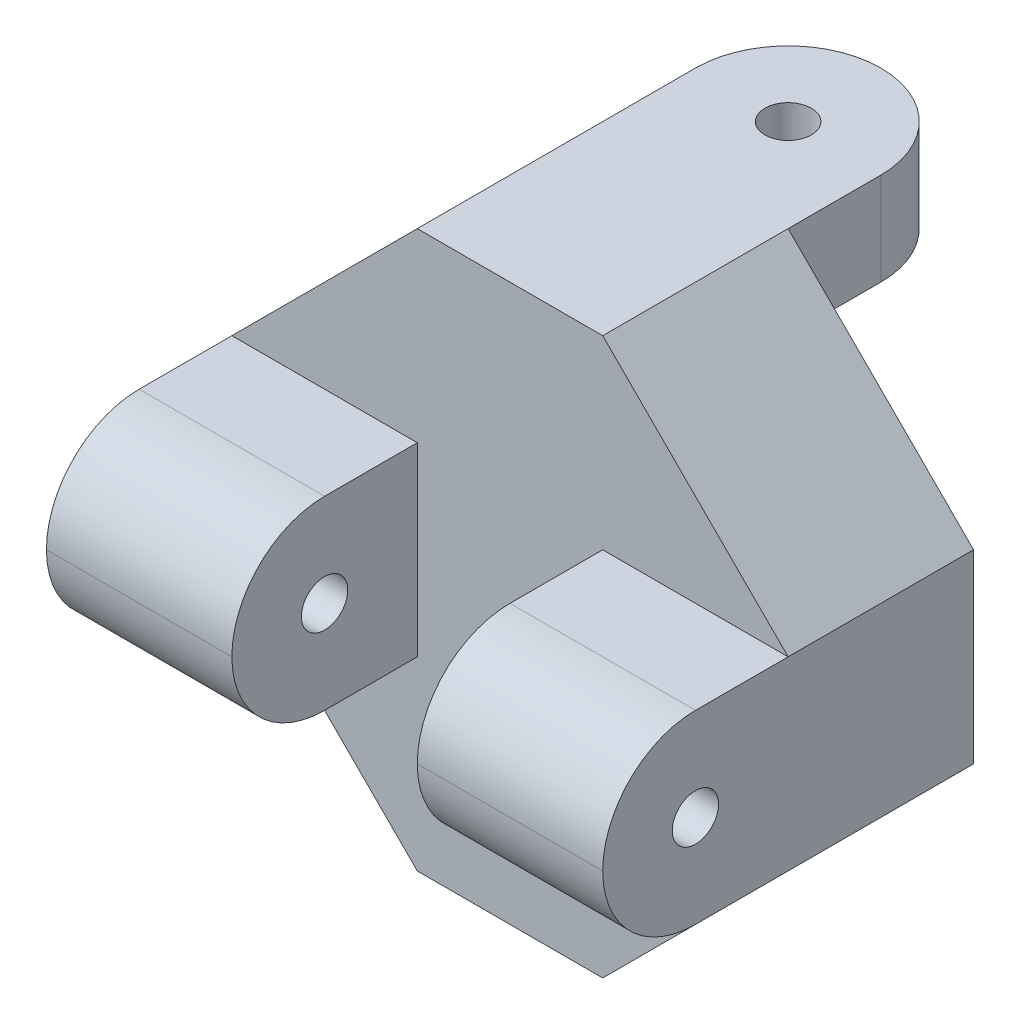
ISO-10303-21;
HEADER;
FILE_DESCRIPTION(('STEP AP214'),'2;1');
FILE_NAME('part.step','',(''),(''),'','','');
FILE_SCHEMA(('AUTOMOTIVE_DESIGN { 1 0 10303 214 1 1 1 1 }'));
ENDSEC;
DATA;
#1=APPLICATION_CONTEXT('core data for automotive mechanical design processes');
#2=APPLICATION_PROTOCOL_DEFINITION('international standard','automotive_design',2000,#1);
#3=PRODUCT_CONTEXT('',#1,'mechanical');
#4=PRODUCT('Part','Part','',(#3));
#5=PRODUCT_RELATED_PRODUCT_CATEGORY('part','',(#4));
#6=PRODUCT_DEFINITION_FORMATION('','',#4);
#7=PRODUCT_DEFINITION_CONTEXT('part definition',#1,'design');
#8=PRODUCT_DEFINITION('design','',#6,#7);
#9=PRODUCT_DEFINITION_SHAPE('','',#8);
#10=(LENGTH_UNIT() NAMED_UNIT(*) SI_UNIT(.MILLI.,.METRE.));
#11=(NAMED_UNIT(*) PLANE_ANGLE_UNIT() SI_UNIT($,.RADIAN.));
#12=(NAMED_UNIT(*) SI_UNIT($,.STERADIAN.) SOLID_ANGLE_UNIT());
#13=UNCERTAINTY_MEASURE_WITH_UNIT(LENGTH_MEASURE(1.E-05),#10,'distance_accuracy_value','');
#14=(GEOMETRIC_REPRESENTATION_CONTEXT(3) GLOBAL_UNCERTAINTY_ASSIGNED_CONTEXT((#13)) GLOBAL_UNIT_ASSIGNED_CONTEXT((#10,
#11,#12)) REPRESENTATION_CONTEXT('',''));
#15=CARTESIAN_POINT('',(0.,0.,0.));
#16=DIRECTION('',(0.,0.,1.));
#17=DIRECTION('',(1.,0.,0.));
#18=AXIS2_PLACEMENT_3D('',#15,#16,#17);
#19=CARTESIAN_POINT('',(1.70002900645727E-13,-61.3210244842767,0.));
#20=DIRECTION('',(1.,0.,0.));
#21=DIRECTION('',(0.,0.,-1.));
#22=AXIS2_PLACEMENT_3D('',#19,#20,#21);
#23=PLANE('',#22);
#24=DIRECTION('',(0.,1.,0.));
#25=VECTOR('',#24,1.);
#26=CARTESIAN_POINT('',(0.,-61.3210244842767,-50.8));
#27=LINE('',#26,#25);
#28=CARTESIAN_POINT('',(0.,38.1,-50.8));
#29=VERTEX_POINT('',#28);
#30=CARTESIAN_POINT('',(0.,50.8,-50.8));
#31=VERTEX_POINT('',#30);
#32=EDGE_CURVE('E241',#29,#31,#27,.T.);
#33=ORIENTED_EDGE('',*,*,#32,.F.);
#34=DIRECTION('',(0.,0.,1.));
#35=VECTOR('',#34,1.);
#36=CARTESIAN_POINT('',(1.70002900645727E-13,38.1,0.));
#37=LINE('',#36,#35);
#38=CARTESIAN_POINT('',(0.,38.1,-38.0999999999999));
#39=VERTEX_POINT('',#38);
#40=EDGE_CURVE('E439',#29,#39,#37,.T.);
#41=ORIENTED_EDGE('',*,*,#40,.T.);
#42=DIRECTION('',(0.,1.,0.));
#43=VECTOR('',#42,1.);
#44=CARTESIAN_POINT('',(0.,-61.3210244842767,-38.1));
#45=LINE('',#44,#43);
#46=CARTESIAN_POINT('',(0.,50.8,-38.1));
#47=VERTEX_POINT('',#46);
#48=EDGE_CURVE('E236',#39,#47,#45,.T.);
#49=ORIENTED_EDGE('',*,*,#48,.T.);
#50=DIRECTION('',(0.,0.,-1.));
#51=VECTOR('',#50,1.);
#52=CARTESIAN_POINT('',(1.70002900645727E-13,50.8,0.));
#53=LINE('',#52,#51);
#54=EDGE_CURVE('E455',#47,#31,#53,.T.);
#55=ORIENTED_EDGE('',*,*,#54,.T.);
#56=EDGE_LOOP('',(#33,#41,#49,#55));
#57=FACE_BOUND('',#56,.T.);
#58=ADVANCED_FACE('F47',(#57),#23,.F.);
#59=CARTESIAN_POINT('',(25.3999999999999,-61.3210244842767,0.));
#60=DIRECTION('',(1.,0.,0.));
#61=DIRECTION('',(0.,0.,-1.));
#62=AXIS2_PLACEMENT_3D('',#59,#60,#61);
#63=PLANE('',#62);
#64=DIRECTION('',(0.,0.,1.));
#65=VECTOR('',#64,1.);
#66=CARTESIAN_POINT('',(25.3999999999999,38.1,-38.0999999999999));
#67=LINE('',#66,#65);
#68=CARTESIAN_POINT('',(25.3999999999999,38.1,-50.8));
#69=VERTEX_POINT('',#68);
#70=CARTESIAN_POINT('',(25.3999999999999,38.1,-38.0999999999999));
#71=VERTEX_POINT('',#70);
#72=EDGE_CURVE('E207',#69,#71,#67,.T.);
#73=ORIENTED_EDGE('',*,*,#72,.F.);
#74=DIRECTION('',(0.,1.,0.));
#75=VECTOR('',#74,1.);
#76=CARTESIAN_POINT('',(25.4,-61.3210244842767,-50.8));
#77=LINE('',#76,#75);
#78=CARTESIAN_POINT('',(25.4,50.8,-50.8));
#79=VERTEX_POINT('',#78);
#80=EDGE_CURVE('E225',#69,#79,#77,.T.);
#81=ORIENTED_EDGE('',*,*,#80,.T.);
#82=DIRECTION('',(0.,0.,-1.));
#83=VECTOR('',#82,1.);
#84=CARTESIAN_POINT('',(25.3999999999999,50.8,0.));
#85=LINE('',#84,#83);
#86=CARTESIAN_POINT('',(25.4,50.8,-38.1));
#87=VERTEX_POINT('',#86);
#88=EDGE_CURVE('E459',#87,#79,#85,.T.);
#89=ORIENTED_EDGE('',*,*,#88,.F.);
#90=DIRECTION('',(0.,1.,0.));
#91=VECTOR('',#90,1.);
#92=CARTESIAN_POINT('',(25.4,-61.3210244842767,-38.1));
#93=LINE('',#92,#91);
#94=EDGE_CURVE('E226',#71,#87,#93,.T.);
#95=ORIENTED_EDGE('',*,*,#94,.F.);
#96=EDGE_LOOP('',(#73,#81,#89,#95));
#97=FACE_BOUND('',#96,.T.);
#98=ADVANCED_FACE('F487',(#97),#63,.T.);
#99=CARTESIAN_POINT('',(12.7,-61.3210244842767,-50.8));
#100=DIRECTION('',(0.,1.,0.));
#101=DIRECTION('',(0.,0.,1.));
#102=AXIS2_PLACEMENT_3D('',#99,#100,#101);
#103=CYLINDRICAL_SURFACE('',#102,12.7);
#104=CARTESIAN_POINT('',(12.7,38.1,-50.8));
#105=DIRECTION('',(0.,1.,0.));
#106=DIRECTION('',(0.,0.,1.));
#107=AXIS2_PLACEMENT_3D('',#104,#105,#106);
#108=CIRCLE('',#107,12.7);
#109=EDGE_CURVE('E436',#29,#69,#108,.F.);
#110=ORIENTED_EDGE('',*,*,#109,.F.);
#111=ORIENTED_EDGE('',*,*,#32,.T.);
#112=CARTESIAN_POINT('',(12.7,50.8,-50.8));
#113=DIRECTION('',(0.,1.,0.));
#114=DIRECTION('',(0.,0.,1.));
#115=AXIS2_PLACEMENT_3D('',#112,#113,#114);
#116=CIRCLE('',#115,12.7);
#117=EDGE_CURVE('E443',#79,#31,#116,.T.);
#118=ORIENTED_EDGE('',*,*,#117,.F.);
#119=ORIENTED_EDGE('',*,*,#80,.F.);
#120=EDGE_LOOP('',(#110,#111,#118,#119));
#121=FACE_BOUND('',#120,.T.);
#122=ADVANCED_FACE('F471',(#121),#103,.T.);
#123=CARTESIAN_POINT('',(12.7,-61.3210244842767,-50.8));
#124=DIRECTION('',(0.,1.,0.));
#125=DIRECTION('',(0.,0.,1.));
#126=AXIS2_PLACEMENT_3D('',#123,#124,#125);
#127=CYLINDRICAL_SURFACE('',#126,3.175);
#128=CARTESIAN_POINT('',(12.7,38.1,-50.8));
#129=DIRECTION('',(0.,1.,0.));
#130=DIRECTION('',(0.,0.,1.));
#131=AXIS2_PLACEMENT_3D('',#128,#129,#130);
#132=CIRCLE('',#131,3.175);
#133=CARTESIAN_POINT('',(12.7,38.1,-47.625));
#134=VERTEX_POINT('',#133);
#135=EDGE_CURVE('E51',#134,#134,#132,.F.);
#136=CARTESIAN_POINT('',(12.7,50.8,-50.8));
#137=DIRECTION('',(0.,1.,0.));
#138=DIRECTION('',(0.,0.,1.));
#139=AXIS2_PLACEMENT_3D('',#136,#137,#138);
#140=CIRCLE('',#139,3.175);
#141=CARTESIAN_POINT('',(12.7,50.8,-47.625));
#142=VERTEX_POINT('',#141);
#143=EDGE_CURVE('E462',#142,#142,#140,.T.);
#144=CARTESIAN_POINT('',(12.7,38.1,-47.625));
#145=CARTESIAN_POINT('',(12.7,38.2322916666667,-47.625));
#146=CARTESIAN_POINT('',(12.7,38.3645833333333,-47.625));
#147=CARTESIAN_POINT('',(12.7,38.6291666666667,-47.625));
#148=CARTESIAN_POINT('',(12.7,38.7614583333333,-47.625));
#149=CARTESIAN_POINT('',(12.7,39.0260416666667,-47.625));
#150=CARTESIAN_POINT('',(12.7,39.1583333333333,-47.625));
#151=CARTESIAN_POINT('',(12.7,39.4229166666667,-47.625));
#152=CARTESIAN_POINT('',(12.7,39.5552083333333,-47.625));
#153=CARTESIAN_POINT('',(12.7,39.8197916666667,-47.625));
#154=CARTESIAN_POINT('',(12.7,39.9520833333333,-47.625));
#155=CARTESIAN_POINT('',(12.7,40.2166666666667,-47.625));
#156=CARTESIAN_POINT('',(12.7,40.3489583333333,-47.625));
#157=CARTESIAN_POINT('',(12.7,40.6135416666667,-47.625));
#158=CARTESIAN_POINT('',(12.7,40.7458333333333,-47.625));
#159=CARTESIAN_POINT('',(12.7,41.0104166666667,-47.625));
#160=CARTESIAN_POINT('',(12.7,41.1427083333333,-47.625));
#161=CARTESIAN_POINT('',(12.7,41.4072916666667,-47.625));
#162=CARTESIAN_POINT('',(12.7,41.5395833333333,-47.625));
#163=CARTESIAN_POINT('',(12.7,41.8041666666667,-47.625));
#164=CARTESIAN_POINT('',(12.7,41.9364583333333,-47.625));
#165=CARTESIAN_POINT('',(12.7,42.2010416666667,-47.625));
#166=CARTESIAN_POINT('',(12.7,42.3333333333333,-47.625));
#167=CARTESIAN_POINT('',(12.7,42.5979166666667,-47.625));
#168=CARTESIAN_POINT('',(12.7,42.7302083333333,-47.625));
#169=CARTESIAN_POINT('',(12.7,42.9947916666667,-47.625));
#170=CARTESIAN_POINT('',(12.7,43.1270833333333,-47.625));
#171=CARTESIAN_POINT('',(12.7,43.3916666666667,-47.625));
#172=CARTESIAN_POINT('',(12.7,43.5239583333333,-47.625));
#173=CARTESIAN_POINT('',(12.7,43.7885416666667,-47.625));
#174=CARTESIAN_POINT('',(12.7,43.9208333333333,-47.625));
#175=CARTESIAN_POINT('',(12.7,44.1854166666666,-47.625));
#176=CARTESIAN_POINT('',(12.7,44.3177083333333,-47.625));
#177=CARTESIAN_POINT('',(12.7,44.5822916666667,-47.625));
#178=CARTESIAN_POINT('',(12.7,44.7145833333333,-47.625));
#179=CARTESIAN_POINT('',(12.7,44.9791666666667,-47.625));
#180=CARTESIAN_POINT('',(12.7,45.1114583333333,-47.625));
#181=CARTESIAN_POINT('',(12.7,45.3760416666667,-47.625));
#182=CARTESIAN_POINT('',(12.7,45.5083333333333,-47.625));
#183=CARTESIAN_POINT('',(12.7,45.7729166666667,-47.625));
#184=CARTESIAN_POINT('',(12.7,45.9052083333333,-47.625));
#185=CARTESIAN_POINT('',(12.7,46.1697916666666,-47.625));
#186=CARTESIAN_POINT('',(12.7,46.3020833333333,-47.625));
#187=CARTESIAN_POINT('',(12.7,46.5666666666666,-47.625));
#188=CARTESIAN_POINT('',(12.7,46.6989583333333,-47.625));
#189=CARTESIAN_POINT('',(12.7,46.9635416666667,-47.625));
#190=CARTESIAN_POINT('',(12.7,47.0958333333333,-47.625));
#191=CARTESIAN_POINT('',(12.7,47.3604166666666,-47.625));
#192=CARTESIAN_POINT('',(12.7,47.4927083333333,-47.625));
#193=CARTESIAN_POINT('',(12.7,47.7572916666667,-47.625));
#194=CARTESIAN_POINT('',(12.7,47.8895833333333,-47.625));
#195=CARTESIAN_POINT('',(12.7,48.1541666666667,-47.625));
#196=CARTESIAN_POINT('',(12.7,48.2864583333333,-47.625));
#197=CARTESIAN_POINT('',(12.7,48.5510416666666,-47.625));
#198=CARTESIAN_POINT('',(12.7,48.6833333333333,-47.625));
#199=CARTESIAN_POINT('',(12.7,48.9479166666667,-47.625));
#200=CARTESIAN_POINT('',(12.7,49.0802083333333,-47.625));
#201=CARTESIAN_POINT('',(12.7,49.3447916666667,-47.625));
#202=CARTESIAN_POINT('',(12.7,49.4770833333333,-47.625));
#203=CARTESIAN_POINT('',(12.7,49.7416666666666,-47.625));
#204=CARTESIAN_POINT('',(12.7,49.8739583333333,-47.625));
#205=CARTESIAN_POINT('',(12.7,50.1385416666667,-47.625));
#206=CARTESIAN_POINT('',(12.7,50.2708333333333,-47.625));
#207=CARTESIAN_POINT('',(12.7,50.5354166666666,-47.625));
#208=CARTESIAN_POINT('',(12.7,50.6677083333333,-47.625));
#209=CARTESIAN_POINT('',(12.7,50.8,-47.625));
#210=B_SPLINE_CURVE_WITH_KNOTS('',3,(#144,#145,#146,#147,#148,#149,#150,#151,#152,#153,#154,
#155,#156,#157,#158,#159,#160,#161,#162,#163,#164,#165,#166,#167,#168,#169,#170,#171,#172,#173,
#174,#175,#176,#177,#178,#179,#180,#181,#182,#183,#184,#185,#186,#187,#188,#189,#190,#191,#192,
#193,#194,#195,#196,#197,#198,#199,#200,#201,#202,#203,#204,#205,#206,#207,#208,#209),
.UNSPECIFIED.,.F.,.F.,(4,2,2,2,2,2,2,2,2,2,2,2,2,2,2,2,2,2,2,2,2,2,2,2,2,2,2,2,2,2,2,2,4),(0.,
0.396875000000005,0.793749999999996,1.190625,1.58749999999999,1.984375,2.38125,2.77812499999999,
3.175,3.571875,3.96874999999999,4.365625,4.7625,5.15937499999999,5.55625,5.95312499999999,
6.34999999999999,6.746875,7.14374999999999,7.540625,7.93749999999999,8.33437499999999,8.73125,
9.12812499999999,9.52499999999999,9.921875,10.31875,10.715625,11.1125,11.509375,11.90625,
12.303125,12.7),.UNSPECIFIED.);
#211=EDGE_CURVE('BSEAM582',#134,#142,#210,.T.);
#212=ORIENTED_EDGE('',*,*,#135,.T.);
#213=ORIENTED_EDGE('',*,*,#143,.T.);
#214=ORIENTED_EDGE('',*,*,#211,.T.);
#215=ORIENTED_EDGE('',*,*,#211,.F.);
#216=EDGE_LOOP('',(#212,#214,#213,#215));
#217=FACE_BOUND('',#216,.T.);
#218=ADVANCED_FACE('F582',(#217),#127,.F.);
#219=CARTESIAN_POINT('',(0.,25.4,12.7));
#220=DIRECTION('',(0.,-1.,0.));
#221=DIRECTION('',(1.,0.,0.));
#222=AXIS2_PLACEMENT_3D('',#219,#220,#221);
#223=PLANE('',#222);
#224=DIRECTION('',(0.,0.,-1.));
#225=VECTOR('',#224,1.);
#226=CARTESIAN_POINT('',(-25.4,25.4,12.7));
#227=LINE('',#226,#225);
#228=CARTESIAN_POINT('',(-25.4,25.4,0.));
#229=VERTEX_POINT('',#228);
#230=CARTESIAN_POINT('',(-25.4,25.4,-12.7));
#231=VERTEX_POINT('',#230);
#232=EDGE_CURVE('E376',#229,#231,#227,.T.);
#233=ORIENTED_EDGE('',*,*,#232,.F.);
#234=DIRECTION('',(-1.,0.,0.));
#235=VECTOR('',#234,1.);
#236=CARTESIAN_POINT('',(0.,25.4,0.));
#237=LINE('',#236,#235);
#238=CARTESIAN_POINT('',(0.,25.4,0.));
#239=VERTEX_POINT('',#238);
#240=EDGE_CURVE('E57',#229,#239,#237,.F.);
#241=ORIENTED_EDGE('',*,*,#240,.T.);
#242=DIRECTION('',(0.,0.,-1.));
#243=VECTOR('',#242,1.);
#244=CARTESIAN_POINT('',(0.,25.4,12.7));
#245=LINE('',#244,#243);
#246=CARTESIAN_POINT('',(0.,25.4,-12.7));
#247=VERTEX_POINT('',#246);
#248=EDGE_CURVE('E367',#239,#247,#245,.T.);
#249=ORIENTED_EDGE('',*,*,#248,.T.);
#250=DIRECTION('',(-1.,0.,0.));
#251=VECTOR('',#250,1.);
#252=CARTESIAN_POINT('',(0.,25.4,-12.7));
#253=LINE('',#252,#251);
#254=EDGE_CURVE('E355',#247,#231,#253,.T.);
#255=ORIENTED_EDGE('',*,*,#254,.T.);
#256=EDGE_LOOP('',(#233,#241,#249,#255));
#257=FACE_BOUND('',#256,.T.);
#258=ADVANCED_FACE('F537',(#257),#223,.F.);
#259=CARTESIAN_POINT('',(-25.4,0.,12.7));
#260=DIRECTION('',(1.,0.,0.));
#261=DIRECTION('',(0.,1.,0.));
#262=AXIS2_PLACEMENT_3D('',#259,#260,#261);
#263=PLANE('',#262);
#264=CARTESIAN_POINT('',(-25.4,12.7,0.));
#265=DIRECTION('',(1.,0.,0.));
#266=DIRECTION('',(0.,1.,0.));
#267=AXIS2_PLACEMENT_3D('',#264,#265,#266);
#268=CIRCLE('',#267,3.175);
#269=CARTESIAN_POINT('',(-25.4,15.875,0.));
#270=VERTEX_POINT('',#269);
#271=EDGE_CURVE('E248',#270,#270,#268,.T.);
#272=ORIENTED_EDGE('',*,*,#271,.T.);
#273=EDGE_LOOP('',(#272));
#274=FACE_BOUND('',#273,.T.);
#275=DIRECTION('',(0.,0.,-1.));
#276=VECTOR('',#275,1.);
#277=CARTESIAN_POINT('',(-25.4,0.,12.7));
#278=LINE('',#277,#276);
#279=CARTESIAN_POINT('',(-25.4,0.,0.));
#280=VERTEX_POINT('',#279);
#281=CARTESIAN_POINT('',(-25.4,0.,-12.7));
#282=VERTEX_POINT('',#281);
#283=EDGE_CURVE('E373',#280,#282,#278,.T.);
#284=ORIENTED_EDGE('',*,*,#283,.F.);
#285=CARTESIAN_POINT('',(-25.4,12.7,0.));
#286=DIRECTION('',(1.,0.,0.));
#287=DIRECTION('',(0.,1.,0.));
#288=AXIS2_PLACEMENT_3D('',#285,#286,#287);
#289=CIRCLE('',#288,12.7);
#290=CARTESIAN_POINT('',(-25.4,12.7,12.7));
#291=VERTEX_POINT('',#290);
#292=EDGE_CURVE('E405',#280,#291,#289,.F.);
#293=ORIENTED_EDGE('',*,*,#292,.T.);
#294=CARTESIAN_POINT('',(-25.4,12.7,0.));
#295=DIRECTION('',(1.,0.,0.));
#296=DIRECTION('',(0.,1.,0.));
#297=AXIS2_PLACEMENT_3D('',#294,#295,#296);
#298=CIRCLE('',#297,12.7);
#299=EDGE_CURVE('E402',#291,#229,#298,.F.);
#300=ORIENTED_EDGE('',*,*,#299,.T.);
#301=ORIENTED_EDGE('',*,*,#232,.T.);
#302=DIRECTION('',(0.,0.,1.));
#303=VECTOR('',#302,1.);
#304=CARTESIAN_POINT('',(-25.4,25.4,-38.1));
#305=LINE('',#304,#303);
#306=CARTESIAN_POINT('',(-25.4,25.4,-38.1));
#307=VERTEX_POINT('',#306);
#308=EDGE_CURVE('E335',#307,#231,#305,.T.);
#309=ORIENTED_EDGE('',*,*,#308,.F.);
#310=DIRECTION('',(0.,1.,0.));
#311=VECTOR('',#310,1.);
#312=CARTESIAN_POINT('',(-25.4,25.4,-38.1));
#313=LINE('',#312,#311);
#314=CARTESIAN_POINT('',(-25.4,0.,-38.1));
#315=VERTEX_POINT('',#314);
#316=EDGE_CURVE('E296',#315,#307,#313,.T.);
#317=ORIENTED_EDGE('',*,*,#316,.F.);
#318=DIRECTION('',(0.,0.,1.));
#319=VECTOR('',#318,1.);
#320=CARTESIAN_POINT('',(-25.4,0.,-38.1));
#321=LINE('',#320,#319);
#322=EDGE_CURVE('E339',#315,#282,#321,.T.);
#323=ORIENTED_EDGE('',*,*,#322,.T.);
#324=EDGE_LOOP('',(#284,#293,#300,#301,#309,#317,#323));
#325=FACE_BOUND('',#324,.T.);
#326=ADVANCED_FACE('F532',(#274,#325),#263,.F.);
#327=CARTESIAN_POINT('',(0.,0.,12.7));
#328=DIRECTION('',(0.,-1.,0.));
#329=DIRECTION('',(1.,0.,0.));
#330=AXIS2_PLACEMENT_3D('',#327,#328,#329);
#331=PLANE('',#330);
#332=DIRECTION('',(0.,0.,-1.));
#333=VECTOR('',#332,1.);
#334=CARTESIAN_POINT('',(0.,0.,12.7));
#335=LINE('',#334,#333);
#336=CARTESIAN_POINT('',(0.,0.,0.));
#337=VERTEX_POINT('',#336);
#338=CARTESIAN_POINT('',(0.,0.,-12.7));
#339=VERTEX_POINT('',#338);
#340=EDGE_CURVE('E370',#337,#339,#335,.T.);
#341=ORIENTED_EDGE('',*,*,#340,.F.);
#342=DIRECTION('',(-1.,0.,0.));
#343=VECTOR('',#342,1.);
#344=CARTESIAN_POINT('',(0.,0.,0.));
#345=LINE('',#344,#343);
#346=EDGE_CURVE('E398',#337,#280,#345,.T.);
#347=ORIENTED_EDGE('',*,*,#346,.T.);
#348=ORIENTED_EDGE('',*,*,#283,.T.);
#349=DIRECTION('',(-1.,0.,0.));
#350=VECTOR('',#349,1.);
#351=CARTESIAN_POINT('',(0.,0.,-12.7));
#352=LINE('',#351,#350);
#353=EDGE_CURVE('E359',#339,#282,#352,.T.);
#354=ORIENTED_EDGE('',*,*,#353,.F.);
#355=EDGE_LOOP('',(#341,#347,#348,#354));
#356=FACE_BOUND('',#355,.T.);
#357=ADVANCED_FACE('F543',(#356),#331,.T.);
#358=CARTESIAN_POINT('',(0.,0.,12.7));
#359=DIRECTION('',(-1.,0.,0.));
#360=DIRECTION('',(0.,0.,1.));
#361=AXIS2_PLACEMENT_3D('',#358,#359,#360);
#362=PLANE('',#361);
#363=CARTESIAN_POINT('',(0.,12.7,0.));
#364=DIRECTION('',(-1.,0.,0.));
#365=DIRECTION('',(0.,0.,1.));
#366=AXIS2_PLACEMENT_3D('',#363,#364,#365);
#367=CIRCLE('',#366,3.175);
#368=CARTESIAN_POINT('',(0.,12.7,3.175));
#369=VERTEX_POINT('',#368);
#370=EDGE_CURVE('E258',#369,#369,#367,.T.);
#371=ORIENTED_EDGE('',*,*,#370,.T.);
#372=EDGE_LOOP('',(#371));
#373=FACE_BOUND('',#372,.T.);
#374=CARTESIAN_POINT('',(0.,12.7,0.));
#375=DIRECTION('',(-1.,0.,0.));
#376=DIRECTION('',(0.,0.,1.));
#377=AXIS2_PLACEMENT_3D('',#374,#375,#376);
#378=CIRCLE('',#377,12.7);
#379=CARTESIAN_POINT('',(0.,12.7,12.7));
#380=VERTEX_POINT('',#379);
#381=EDGE_CURVE('E73',#239,#380,#378,.F.);
#382=ORIENTED_EDGE('',*,*,#381,.T.);
#383=CARTESIAN_POINT('',(0.,12.7,0.));
#384=DIRECTION('',(-1.,0.,0.));
#385=DIRECTION('',(0.,0.,1.));
#386=AXIS2_PLACEMENT_3D('',#383,#384,#385);
#387=CIRCLE('',#386,12.7);
#388=EDGE_CURVE('E410',#380,#337,#387,.F.);
#389=ORIENTED_EDGE('',*,*,#388,.T.);
#390=ORIENTED_EDGE('',*,*,#340,.T.);
#391=DIRECTION('',(0.,1.,0.));
#392=VECTOR('',#391,1.);
#393=CARTESIAN_POINT('',(0.,0.,-12.7));
#394=LINE('',#393,#392);
#395=EDGE_CURVE('E363',#339,#247,#394,.T.);
#396=ORIENTED_EDGE('',*,*,#395,.T.);
#397=ORIENTED_EDGE('',*,*,#248,.F.);
#398=EDGE_LOOP('',(#382,#389,#390,#396,#397));
#399=FACE_BOUND('',#398,.T.);
#400=ADVANCED_FACE('F538',(#373,#399),#362,.F.);
#401=CARTESIAN_POINT('',(0.,0.,-12.7));
#402=DIRECTION('',(0.,0.,1.));
#403=DIRECTION('',(1.,0.,0.));
#404=AXIS2_PLACEMENT_3D('',#401,#402,#403);
#405=PLANE('',#404);
#406=DIRECTION('',(1.,0.,0.));
#407=VECTOR('',#406,1.);
#408=CARTESIAN_POINT('',(0.,25.4,-12.7));
#409=LINE('',#408,#407);
#410=CARTESIAN_POINT('',(25.4,25.4,-12.7));
#411=VERTEX_POINT('',#410);
#412=CARTESIAN_POINT('',(50.8,25.4,-12.7));
#413=VERTEX_POINT('',#412);
#414=EDGE_CURVE('E262',#411,#413,#409,.T.);
#415=ORIENTED_EDGE('',*,*,#414,.T.);
#416=DIRECTION('',(0.707106781186547,-0.707106781186548,0.));
#417=VECTOR('',#416,1.);
#418=CARTESIAN_POINT('',(50.8,25.4,-12.7));
#419=LINE('',#418,#417);
#420=CARTESIAN_POINT('',(25.4,50.8,-12.7));
#421=VERTEX_POINT('',#420);
#422=EDGE_CURVE('E290',#421,#413,#419,.T.);
#423=ORIENTED_EDGE('',*,*,#422,.F.);
#424=DIRECTION('',(1.,0.,0.));
#425=VECTOR('',#424,1.);
#426=CARTESIAN_POINT('',(25.4,50.8,-12.7));
#427=LINE('',#426,#425);
#428=CARTESIAN_POINT('',(0.,50.8,-12.7));
#429=VERTEX_POINT('',#428);
#430=EDGE_CURVE('E318',#429,#421,#427,.T.);
#431=ORIENTED_EDGE('',*,*,#430,.F.);
#432=DIRECTION('',(0.707106781186548,0.707106781186547,0.));
#433=VECTOR('',#432,1.);
#434=CARTESIAN_POINT('',(0.,50.8,-12.7));
#435=LINE('',#434,#433);
#436=EDGE_CURVE('E315',#231,#429,#435,.T.);
#437=ORIENTED_EDGE('',*,*,#436,.F.);
#438=ORIENTED_EDGE('',*,*,#254,.F.);
#439=ORIENTED_EDGE('',*,*,#395,.F.);
#440=ORIENTED_EDGE('',*,*,#353,.T.);
#441=DIRECTION('',(-0.707106781186548,0.707106781186547,0.));
#442=VECTOR('',#441,1.);
#443=CARTESIAN_POINT('',(-25.4,0.,-12.7));
#444=LINE('',#443,#442);
#445=CARTESIAN_POINT('',(0.,-25.4,-12.7));
#446=VERTEX_POINT('',#445);
#447=EDGE_CURVE('E311',#446,#282,#444,.T.);
#448=ORIENTED_EDGE('',*,*,#447,.F.);
#449=DIRECTION('',(-1.,0.,0.));
#450=VECTOR('',#449,1.);
#451=CARTESIAN_POINT('',(0.,-25.4,-12.7));
#452=LINE('',#451,#450);
#453=CARTESIAN_POINT('',(25.4,-25.4,-12.7));
#454=VERTEX_POINT('',#453);
#455=EDGE_CURVE('E308',#454,#446,#452,.T.);
#456=ORIENTED_EDGE('',*,*,#455,.F.);
#457=DIRECTION('',(-0.707106781186548,-0.707106781186548,0.));
#458=VECTOR('',#457,1.);
#459=CARTESIAN_POINT('',(25.4,-25.4,-12.7));
#460=LINE('',#459,#458);
#461=CARTESIAN_POINT('',(50.8,0.,-12.7));
#462=VERTEX_POINT('',#461);
#463=EDGE_CURVE('E286',#462,#454,#460,.T.);
#464=ORIENTED_EDGE('',*,*,#463,.F.);
#465=DIRECTION('',(1.,0.,0.));
#466=VECTOR('',#465,1.);
#467=CARTESIAN_POINT('',(0.,0.,-12.7));
#468=LINE('',#467,#466);
#469=CARTESIAN_POINT('',(25.4,0.,-12.7));
#470=VERTEX_POINT('',#469);
#471=EDGE_CURVE('E270',#470,#462,#468,.T.);
#472=ORIENTED_EDGE('',*,*,#471,.F.);
#473=DIRECTION('',(0.,1.,0.));
#474=VECTOR('',#473,1.);
#475=CARTESIAN_POINT('',(25.4,0.,-12.7));
#476=LINE('',#475,#474);
#477=EDGE_CURVE('E266',#470,#411,#476,.T.);
#478=ORIENTED_EDGE('',*,*,#477,.T.);
#479=EDGE_LOOP('',(#415,#423,#431,#437,#438,#439,#440,#448,#456,#464,#472,#478));
#480=FACE_BOUND('',#479,.T.);
#481=ADVANCED_FACE('F501',(#480),#405,.T.);
#482=CARTESIAN_POINT('',(50.8,0.,-38.1));
#483=DIRECTION('',(-1.,0.,0.));
#484=DIRECTION('',(0.,-1.,0.));
#485=AXIS2_PLACEMENT_3D('',#482,#483,#484);
#486=PLANE('',#485);
#487=CARTESIAN_POINT('',(50.8,12.7,0.));
#488=DIRECTION('',(1.,0.,0.));
#489=DIRECTION('',(0.,1.,0.));
#490=AXIS2_PLACEMENT_3D('',#487,#488,#489);
#491=CIRCLE('',#490,3.175);
#492=CARTESIAN_POINT('',(50.8,15.875,0.));
#493=VERTEX_POINT('',#492);
#494=EDGE_CURVE('E253',#493,#493,#491,.T.);
#495=ORIENTED_EDGE('',*,*,#494,.F.);
#496=EDGE_LOOP('',(#495));
#497=FACE_BOUND('',#496,.T.);
#498=CARTESIAN_POINT('',(50.8,12.7,0.));
#499=DIRECTION('',(-1.,0.,0.));
#500=DIRECTION('',(0.,-1.,0.));
#501=AXIS2_PLACEMENT_3D('',#498,#499,#500);
#502=CIRCLE('',#501,12.7);
#503=CARTESIAN_POINT('',(50.8,25.4,0.));
#504=VERTEX_POINT('',#503);
#505=CARTESIAN_POINT('',(50.8,12.7,12.7));
#506=VERTEX_POINT('',#505);
#507=EDGE_CURVE('E379',#504,#506,#502,.F.);
#508=ORIENTED_EDGE('',*,*,#507,.T.);
#509=CARTESIAN_POINT('',(50.8,12.7,0.));
#510=DIRECTION('',(-1.,0.,0.));
#511=DIRECTION('',(0.,-1.,0.));
#512=AXIS2_PLACEMENT_3D('',#509,#510,#511);
#513=CIRCLE('',#512,12.7);
#514=CARTESIAN_POINT('',(50.8,0.,0.));
#515=VERTEX_POINT('',#514);
#516=EDGE_CURVE('E385',#506,#515,#513,.F.);
#517=ORIENTED_EDGE('',*,*,#516,.T.);
#518=DIRECTION('',(0.,0.,-1.));
#519=VECTOR('',#518,1.);
#520=CARTESIAN_POINT('',(50.8,0.,12.7));
#521=LINE('',#520,#519);
#522=EDGE_CURVE('E274',#515,#462,#521,.T.);
#523=ORIENTED_EDGE('',*,*,#522,.T.);
#524=DIRECTION('',(0.,0.,1.));
#525=VECTOR('',#524,1.);
#526=CARTESIAN_POINT('',(50.8,0.,-38.1));
#527=LINE('',#526,#525);
#528=CARTESIAN_POINT('',(50.8,0.,-38.1));
#529=VERTEX_POINT('',#528);
#530=EDGE_CURVE('E351',#529,#462,#527,.T.);
#531=ORIENTED_EDGE('',*,*,#530,.F.);
#532=DIRECTION('',(0.,-1.,0.));
#533=VECTOR('',#532,1.);
#534=CARTESIAN_POINT('',(50.8,0.,-38.1));
#535=LINE('',#534,#533);
#536=CARTESIAN_POINT('',(50.8,25.4,-38.1));
#537=VERTEX_POINT('',#536);
#538=EDGE_CURVE('E287',#537,#529,#535,.T.);
#539=ORIENTED_EDGE('',*,*,#538,.F.);
#540=DIRECTION('',(0.,0.,1.));
#541=VECTOR('',#540,1.);
#542=CARTESIAN_POINT('',(50.8,25.4,-38.1));
#543=LINE('',#542,#541);
#544=EDGE_CURVE('E305',#537,#413,#543,.T.);
#545=ORIENTED_EDGE('',*,*,#544,.T.);
#546=DIRECTION('',(0.,0.,-1.));
#547=VECTOR('',#546,1.);
#548=CARTESIAN_POINT('',(50.8,25.4,12.7));
#549=LINE('',#548,#547);
#550=EDGE_CURVE('E283',#504,#413,#549,.T.);
#551=ORIENTED_EDGE('',*,*,#550,.F.);
#552=EDGE_LOOP('',(#508,#517,#523,#531,#539,#545,#551));
#553=FACE_BOUND('',#552,.T.);
#554=ADVANCED_FACE('F510',(#497,#553),#486,.F.);
#555=CARTESIAN_POINT('',(25.4,-25.4,-38.1));
#556=DIRECTION('',(-0.707106781186548,0.707106781186548,0.));
#557=DIRECTION('',(-0.707106781186548,-0.707106781186548,0.));
#558=AXIS2_PLACEMENT_3D('',#555,#556,#557);
#559=PLANE('',#558);
#560=ORIENTED_EDGE('',*,*,#463,.T.);
#561=DIRECTION('',(0.,0.,1.));
#562=VECTOR('',#561,1.);
#563=CARTESIAN_POINT('',(25.4,-25.4,-38.1));
#564=LINE('',#563,#562);
#565=CARTESIAN_POINT('',(25.4,-25.4,-38.1));
#566=VERTEX_POINT('',#565);
#567=EDGE_CURVE('E347',#566,#454,#564,.T.);
#568=ORIENTED_EDGE('',*,*,#567,.F.);
#569=DIRECTION('',(-0.707106781186548,-0.707106781186548,0.));
#570=VECTOR('',#569,1.);
#571=CARTESIAN_POINT('',(25.4,-25.4,-38.1));
#572=LINE('',#571,#570);
#573=EDGE_CURVE('E222',#529,#566,#572,.T.);
#574=ORIENTED_EDGE('',*,*,#573,.F.);
#575=ORIENTED_EDGE('',*,*,#530,.T.);
#576=EDGE_LOOP('',(#560,#568,#574,#575));
#577=FACE_BOUND('',#576,.T.);
#578=ADVANCED_FACE('F515',(#577),#559,.F.);
#579=CARTESIAN_POINT('',(0.,-25.4,-38.1));
#580=DIRECTION('',(0.,1.,0.));
#581=DIRECTION('',(0.,0.,1.));
#582=AXIS2_PLACEMENT_3D('',#579,#580,#581);
#583=PLANE('',#582);
#584=ORIENTED_EDGE('',*,*,#455,.T.);
#585=DIRECTION('',(0.,0.,1.));
#586=VECTOR('',#585,1.);
#587=CARTESIAN_POINT('',(0.,-25.4,-38.1));
#588=LINE('',#587,#586);
#589=CARTESIAN_POINT('',(0.,-25.4,-38.1));
#590=VERTEX_POINT('',#589);
#591=EDGE_CURVE('E343',#590,#446,#588,.T.);
#592=ORIENTED_EDGE('',*,*,#591,.F.);
#593=DIRECTION('',(0.,0.,1.));
#594=VECTOR('',#593,1.);
#595=CARTESIAN_POINT('',(1.70002900645727E-13,-25.4,0.));
#596=LINE('',#595,#594);
#597=CARTESIAN_POINT('',(0.,-25.4,-50.8));
#598=VERTEX_POINT('',#597);
#599=EDGE_CURVE('E444',#598,#590,#596,.T.);
#600=ORIENTED_EDGE('',*,*,#599,.F.);
#601=CARTESIAN_POINT('',(12.7,-25.4,-50.8));
#602=DIRECTION('',(0.,1.,0.));
#603=DIRECTION('',(0.,0.,1.));
#604=AXIS2_PLACEMENT_3D('',#601,#602,#603);
#605=CIRCLE('',#604,12.7);
#606=CARTESIAN_POINT('',(25.4,-25.4,-50.8));
#607=VERTEX_POINT('',#606);
#608=EDGE_CURVE('E247',#598,#607,#605,.F.);
#609=ORIENTED_EDGE('',*,*,#608,.T.);
#610=DIRECTION('',(0.,0.,1.));
#611=VECTOR('',#610,1.);
#612=CARTESIAN_POINT('',(25.3999999999999,-25.4,0.));
#613=LINE('',#612,#611);
#614=EDGE_CURVE('E447',#607,#566,#613,.T.);
#615=ORIENTED_EDGE('',*,*,#614,.T.);
#616=ORIENTED_EDGE('',*,*,#567,.T.);
#617=EDGE_LOOP('',(#584,#592,#600,#609,#615,#616));
#618=FACE_BOUND('',#617,.T.);
#619=CARTESIAN_POINT('',(12.7,-25.4,-50.8));
#620=DIRECTION('',(0.,1.,0.));
#621=DIRECTION('',(0.,0.,1.));
#622=AXIS2_PLACEMENT_3D('',#619,#620,#621);
#623=CIRCLE('',#622,3.175);
#624=CARTESIAN_POINT('',(12.7,-25.4,-47.625));
#625=VERTEX_POINT('',#624);
#626=EDGE_CURVE('E242',#625,#625,#623,.F.);
#627=ORIENTED_EDGE('',*,*,#626,.F.);
#628=EDGE_LOOP('',(#627));
#629=FACE_BOUND('',#628,.T.);
#630=ADVANCED_FACE('F519',(#618,#629),#583,.F.);
#631=CARTESIAN_POINT('',(-25.4,0.,-38.1));
#632=DIRECTION('',(0.707106781186547,0.707106781186548,0.));
#633=DIRECTION('',(-0.707106781186548,0.707106781186547,0.));
#634=AXIS2_PLACEMENT_3D('',#631,#632,#633);
#635=PLANE('',#634);
#636=ORIENTED_EDGE('',*,*,#447,.T.);
#637=ORIENTED_EDGE('',*,*,#322,.F.);
#638=DIRECTION('',(-0.707106781186548,0.707106781186547,0.));
#639=VECTOR('',#638,1.);
#640=CARTESIAN_POINT('',(-25.4,0.,-38.1));
#641=LINE('',#640,#639);
#642=EDGE_CURVE('E293',#590,#315,#641,.T.);
#643=ORIENTED_EDGE('',*,*,#642,.F.);
#644=ORIENTED_EDGE('',*,*,#591,.T.);
#645=EDGE_LOOP('',(#636,#637,#643,#644));
#646=FACE_BOUND('',#645,.T.);
#647=ADVANCED_FACE('F528',(#646),#635,.F.);
#648=CARTESIAN_POINT('',(0.,50.8,-38.1));
#649=DIRECTION('',(0.707106781186547,-0.707106781186548,0.));
#650=DIRECTION('',(0.707106781186548,0.707106781186547,0.));
#651=AXIS2_PLACEMENT_3D('',#648,#649,#650);
#652=PLANE('',#651);
#653=ORIENTED_EDGE('',*,*,#436,.T.);
#654=DIRECTION('',(0.,0.,1.));
#655=VECTOR('',#654,1.);
#656=CARTESIAN_POINT('',(0.,50.8,-38.1));
#657=LINE('',#656,#655);
#658=EDGE_CURVE('E331',#47,#429,#657,.T.);
#659=ORIENTED_EDGE('',*,*,#658,.F.);
#660=DIRECTION('',(0.707106781186548,0.707106781186547,0.));
#661=VECTOR('',#660,1.);
#662=CARTESIAN_POINT('',(0.,50.8,-38.1));
#663=LINE('',#662,#661);
#664=EDGE_CURVE('E299',#307,#47,#663,.T.);
#665=ORIENTED_EDGE('',*,*,#664,.F.);
#666=ORIENTED_EDGE('',*,*,#308,.T.);
#667=EDGE_LOOP('',(#653,#659,#665,#666));
#668=FACE_BOUND('',#667,.T.);
#669=ADVANCED_FACE('F496',(#668),#652,.F.);
#670=CARTESIAN_POINT('',(25.4,50.8,-38.1));
#671=DIRECTION('',(0.,-1.,0.));
#672=DIRECTION('',(0.,0.,-1.));
#673=AXIS2_PLACEMENT_3D('',#670,#671,#672);
#674=PLANE('',#673);
#675=ORIENTED_EDGE('',*,*,#430,.T.);
#676=DIRECTION('',(0.,0.,1.));
#677=VECTOR('',#676,1.);
#678=CARTESIAN_POINT('',(25.4,50.8,-38.1));
#679=LINE('',#678,#677);
#680=EDGE_CURVE('E327',#87,#421,#679,.T.);
#681=ORIENTED_EDGE('',*,*,#680,.F.);
#682=ORIENTED_EDGE('',*,*,#88,.T.);
#683=ORIENTED_EDGE('',*,*,#117,.T.);
#684=ORIENTED_EDGE('',*,*,#54,.F.);
#685=ORIENTED_EDGE('',*,*,#658,.T.);
#686=EDGE_LOOP('',(#675,#681,#682,#683,#684,#685));
#687=FACE_BOUND('',#686,.T.);
#688=ORIENTED_EDGE('',*,*,#143,.F.);
#689=EDGE_LOOP('',(#688));
#690=FACE_BOUND('',#689,.T.);
#691=ADVANCED_FACE('F479',(#687,#690),#674,.F.);
#692=CARTESIAN_POINT('',(50.8,25.4,-38.1));
#693=DIRECTION('',(-0.707106781186548,-0.707106781186547,0.));
#694=DIRECTION('',(0.707106781186547,-0.707106781186548,0.));
#695=AXIS2_PLACEMENT_3D('',#692,#693,#694);
#696=PLANE('',#695);
#697=ORIENTED_EDGE('',*,*,#422,.T.);
#698=ORIENTED_EDGE('',*,*,#544,.F.);
#699=DIRECTION('',(0.707106781186547,-0.707106781186548,0.));
#700=VECTOR('',#699,1.);
#701=CARTESIAN_POINT('',(50.8,25.4,-38.1));
#702=LINE('',#701,#700);
#703=EDGE_CURVE('E302',#87,#537,#702,.T.);
#704=ORIENTED_EDGE('',*,*,#703,.F.);
#705=ORIENTED_EDGE('',*,*,#680,.T.);
#706=EDGE_LOOP('',(#697,#698,#704,#705));
#707=FACE_BOUND('',#706,.T.);
#708=ADVANCED_FACE('F506',(#707),#696,.F.);
#709=CARTESIAN_POINT('',(0.,0.,-38.1));
#710=DIRECTION('',(0.,0.,1.));
#711=DIRECTION('',(1.,0.,0.));
#712=AXIS2_PLACEMENT_3D('',#709,#710,#711);
#713=PLANE('',#712);
#714=ORIENTED_EDGE('',*,*,#573,.T.);
#715=CARTESIAN_POINT('',(25.3999999999999,-12.7,-38.0999999999999));
#716=VERTEX_POINT('',#715);
#717=EDGE_CURVE('E214',#566,#716,#93,.T.);
#718=ORIENTED_EDGE('',*,*,#717,.T.);
#719=DIRECTION('',(1.,0.,0.));
#720=VECTOR('',#719,1.);
#721=CARTESIAN_POINT('',(-25.4,-12.7,-38.0999999999999));
#722=LINE('',#721,#720);
#723=CARTESIAN_POINT('',(0.,-12.7,-38.0999999999999));
#724=VERTEX_POINT('',#723);
#725=EDGE_CURVE('E197',#724,#716,#722,.T.);
#726=ORIENTED_EDGE('',*,*,#725,.F.);
#727=EDGE_CURVE('E231',#590,#724,#45,.T.);
#728=ORIENTED_EDGE('',*,*,#727,.F.);
#729=ORIENTED_EDGE('',*,*,#642,.T.);
#730=ORIENTED_EDGE('',*,*,#316,.T.);
#731=ORIENTED_EDGE('',*,*,#664,.T.);
#732=ORIENTED_EDGE('',*,*,#48,.F.);
#733=DIRECTION('',(1.,0.,0.));
#734=VECTOR('',#733,1.);
#735=CARTESIAN_POINT('',(-25.4,38.1,-38.0999999999999));
#736=LINE('',#735,#734);
#737=EDGE_CURVE('E206',#39,#71,#736,.T.);
#738=ORIENTED_EDGE('',*,*,#737,.T.);
#739=ORIENTED_EDGE('',*,*,#94,.T.);
#740=ORIENTED_EDGE('',*,*,#703,.T.);
#741=ORIENTED_EDGE('',*,*,#538,.T.);
#742=EDGE_LOOP('',(#714,#718,#726,#728,#729,#730,#731,#732,#738,#739,#740,#741));
#743=FACE_BOUND('',#742,.T.);
#744=ADVANCED_FACE('F220',(#743),#713,.F.);
#745=CARTESIAN_POINT('',(0.,25.4,12.7));
#746=DIRECTION('',(0.,1.,0.));
#747=DIRECTION('',(0.,0.,1.));
#748=AXIS2_PLACEMENT_3D('',#745,#746,#747);
#749=PLANE('',#748);
#750=DIRECTION('',(0.,0.,-1.));
#751=VECTOR('',#750,1.);
#752=CARTESIAN_POINT('',(25.4,25.4,12.7));
#753=LINE('',#752,#751);
#754=CARTESIAN_POINT('',(25.4,25.4,0.));
#755=VERTEX_POINT('',#754);
#756=EDGE_CURVE('E280',#755,#411,#753,.T.);
#757=ORIENTED_EDGE('',*,*,#756,.F.);
#758=DIRECTION('',(1.,0.,0.));
#759=VECTOR('',#758,1.);
#760=CARTESIAN_POINT('',(0.,25.4,0.));
#761=LINE('',#760,#759);
#762=EDGE_CURVE('E11',#755,#504,#761,.T.);
#763=ORIENTED_EDGE('',*,*,#762,.T.);
#764=ORIENTED_EDGE('',*,*,#550,.T.);
#765=ORIENTED_EDGE('',*,*,#414,.F.);
#766=EDGE_LOOP('',(#757,#763,#764,#765));
#767=FACE_BOUND('',#766,.T.);
#768=ADVANCED_FACE('F698',(#767),#749,.T.);
#769=CARTESIAN_POINT('',(25.4,0.,12.7));
#770=DIRECTION('',(-1.,0.,0.));
#771=DIRECTION('',(0.,-1.,0.));
#772=AXIS2_PLACEMENT_3D('',#769,#770,#771);
#773=PLANE('',#772);
#774=CARTESIAN_POINT('',(25.4,12.7,0.));
#775=DIRECTION('',(-1.,0.,0.));
#776=DIRECTION('',(0.,-1.,0.));
#777=AXIS2_PLACEMENT_3D('',#774,#775,#776);
#778=CIRCLE('',#777,3.175);
#779=CARTESIAN_POINT('',(25.4,9.52499999999998,0.));
#780=VERTEX_POINT('',#779);
#781=EDGE_CURVE('E252',#780,#780,#778,.T.);
#782=ORIENTED_EDGE('',*,*,#781,.F.);
#783=EDGE_LOOP('',(#782));
#784=FACE_BOUND('',#783,.T.);
#785=DIRECTION('',(0.,0.,-1.));
#786=VECTOR('',#785,1.);
#787=CARTESIAN_POINT('',(25.4,0.,12.7));
#788=LINE('',#787,#786);
#789=CARTESIAN_POINT('',(25.4,0.,0.));
#790=VERTEX_POINT('',#789);
#791=EDGE_CURVE('E277',#790,#470,#788,.T.);
#792=ORIENTED_EDGE('',*,*,#791,.F.);
#793=CARTESIAN_POINT('',(25.4,12.7,0.));
#794=DIRECTION('',(-1.,0.,0.));
#795=DIRECTION('',(0.,-1.,0.));
#796=AXIS2_PLACEMENT_3D('',#793,#794,#795);
#797=CIRCLE('',#796,12.7);
#798=CARTESIAN_POINT('',(25.4,12.7,12.7));
#799=VERTEX_POINT('',#798);
#800=EDGE_CURVE('E395',#790,#799,#797,.T.);
#801=ORIENTED_EDGE('',*,*,#800,.T.);
#802=CARTESIAN_POINT('',(25.4,12.7,0.));
#803=DIRECTION('',(-1.,0.,0.));
#804=DIRECTION('',(0.,-1.,0.));
#805=AXIS2_PLACEMENT_3D('',#802,#803,#804);
#806=CIRCLE('',#805,12.7);
#807=EDGE_CURVE('E392',#799,#755,#806,.T.);
#808=ORIENTED_EDGE('',*,*,#807,.T.);
#809=ORIENTED_EDGE('',*,*,#756,.T.);
#810=ORIENTED_EDGE('',*,*,#477,.F.);
#811=EDGE_LOOP('',(#792,#801,#808,#809,#810));
#812=FACE_BOUND('',#811,.T.);
#813=ADVANCED_FACE('F764',(#784,#812),#773,.T.);
#814=CARTESIAN_POINT('',(0.,0.,12.7));
#815=DIRECTION('',(0.,1.,0.));
#816=DIRECTION('',(-1.,0.,0.));
#817=AXIS2_PLACEMENT_3D('',#814,#815,#816);
#818=PLANE('',#817);
#819=ORIENTED_EDGE('',*,*,#522,.F.);
#820=DIRECTION('',(1.,0.,0.));
#821=VECTOR('',#820,1.);
#822=CARTESIAN_POINT('',(25.4,0.,0.));
#823=LINE('',#822,#821);
#824=EDGE_CURVE('E388',#515,#790,#823,.F.);
#825=ORIENTED_EDGE('',*,*,#824,.T.);
#826=ORIENTED_EDGE('',*,*,#791,.T.);
#827=ORIENTED_EDGE('',*,*,#471,.T.);
#828=EDGE_LOOP('',(#819,#825,#826,#827));
#829=FACE_BOUND('',#828,.T.);
#830=ADVANCED_FACE('F691',(#829),#818,.F.);
#831=CARTESIAN_POINT('',(-25.4,12.7,0.));
#832=DIRECTION('',(1.,0.,0.));
#833=DIRECTION('',(0.,1.,0.));
#834=AXIS2_PLACEMENT_3D('',#831,#832,#833);
#835=CYLINDRICAL_SURFACE('',#834,3.175);
#836=ORIENTED_EDGE('',*,*,#781,.T.);
#837=EDGE_LOOP('',(#836));
#838=FACE_BOUND('',#837,.T.);
#839=ORIENTED_EDGE('',*,*,#494,.T.);
#840=EDGE_LOOP('',(#839));
#841=FACE_BOUND('',#840,.T.);
#842=ADVANCED_FACE('F683',(#838,#841),#835,.F.);
#843=ORIENTED_EDGE('',*,*,#271,.F.);
#844=EDGE_LOOP('',(#843));
#845=FACE_BOUND('',#844,.T.);
#846=ORIENTED_EDGE('',*,*,#370,.F.);
#847=EDGE_LOOP('',(#846));
#848=FACE_BOUND('',#847,.T.);
#849=ADVANCED_FACE('F674',(#845,#848),#835,.F.);
#850=CARTESIAN_POINT('',(0.,12.7,0.));
#851=DIRECTION('',(1.,0.,0.));
#852=DIRECTION('',(0.,0.,-1.));
#853=AXIS2_PLACEMENT_3D('',#850,#851,#852);
#854=CYLINDRICAL_SURFACE('',#853,12.7);
#855=ORIENTED_EDGE('',*,*,#762,.F.);
#856=ORIENTED_EDGE('',*,*,#807,.F.);
#857=DIRECTION('',(1.,0.,0.));
#858=VECTOR('',#857,1.);
#859=CARTESIAN_POINT('',(0.,12.7,12.7));
#860=LINE('',#859,#858);
#861=EDGE_CURVE('E257',#506,#799,#860,.F.);
#862=ORIENTED_EDGE('',*,*,#861,.F.);
#863=ORIENTED_EDGE('',*,*,#507,.F.);
#864=EDGE_LOOP('',(#855,#856,#862,#863));
#865=FACE_BOUND('',#864,.T.);
#866=ADVANCED_FACE('F554',(#865),#854,.T.);
#867=CARTESIAN_POINT('',(0.,12.7,0.));
#868=DIRECTION('',(-1.,0.,0.));
#869=DIRECTION('',(0.,-1.,0.));
#870=AXIS2_PLACEMENT_3D('',#867,#868,#869);
#871=CYLINDRICAL_SURFACE('',#870,12.7);
#872=ORIENTED_EDGE('',*,*,#800,.F.);
#873=ORIENTED_EDGE('',*,*,#824,.F.);
#874=ORIENTED_EDGE('',*,*,#516,.F.);
#875=ORIENTED_EDGE('',*,*,#861,.T.);
#876=EDGE_LOOP('',(#872,#873,#874,#875));
#877=FACE_BOUND('',#876,.T.);
#878=ADVANCED_FACE('F548',(#877),#871,.T.);
#879=CARTESIAN_POINT('',(0.,12.7,0.));
#880=DIRECTION('',(1.,0.,0.));
#881=DIRECTION('',(0.,1.,0.));
#882=AXIS2_PLACEMENT_3D('',#879,#880,#881);
#883=CYLINDRICAL_SURFACE('',#882,12.7);
#884=DIRECTION('',(-1.,0.,0.));
#885=VECTOR('',#884,1.);
#886=CARTESIAN_POINT('',(-25.4,12.7,12.7));
#887=LINE('',#886,#885);
#888=EDGE_CURVE('E246',#380,#291,#887,.T.);
#889=ORIENTED_EDGE('',*,*,#888,.F.);
#890=ORIENTED_EDGE('',*,*,#381,.F.);
#891=ORIENTED_EDGE('',*,*,#240,.F.);
#892=ORIENTED_EDGE('',*,*,#299,.F.);
#893=EDGE_LOOP('',(#889,#890,#891,#892));
#894=FACE_BOUND('',#893,.T.);
#895=ADVANCED_FACE('F49',(#894),#883,.T.);
#896=CARTESIAN_POINT('',(0.,12.7,0.));
#897=DIRECTION('',(-1.,0.,0.));
#898=DIRECTION('',(0.,-1.,0.));
#899=AXIS2_PLACEMENT_3D('',#896,#897,#898);
#900=CYLINDRICAL_SURFACE('',#899,12.7);
#901=ORIENTED_EDGE('',*,*,#388,.F.);
#902=ORIENTED_EDGE('',*,*,#888,.T.);
#903=ORIENTED_EDGE('',*,*,#292,.F.);
#904=ORIENTED_EDGE('',*,*,#346,.F.);
#905=EDGE_LOOP('',(#901,#902,#903,#904));
#906=FACE_BOUND('',#905,.T.);
#907=ADVANCED_FACE('F545',(#906),#900,.T.);
#908=ORIENTED_EDGE('',*,*,#727,.T.);
#909=DIRECTION('',(0.,0.,-1.));
#910=VECTOR('',#909,1.);
#911=CARTESIAN_POINT('',(1.70002900645727E-13,-12.7,0.));
#912=LINE('',#911,#910);
#913=CARTESIAN_POINT('',(0.,-12.7,-50.8));
#914=VERTEX_POINT('',#913);
#915=EDGE_CURVE('E200',#724,#914,#912,.T.);
#916=ORIENTED_EDGE('',*,*,#915,.T.);
#917=EDGE_CURVE('E237',#598,#914,#27,.T.);
#918=ORIENTED_EDGE('',*,*,#917,.F.);
#919=ORIENTED_EDGE('',*,*,#599,.T.);
#920=EDGE_LOOP('',(#908,#916,#918,#919));
#921=FACE_BOUND('',#920,.T.);
#922=ADVANCED_FACE('F553',(#921),#23,.F.);
#923=DIRECTION('',(0.,0.,-1.));
#924=VECTOR('',#923,1.);
#925=CARTESIAN_POINT('',(25.3999999999999,-12.7,-38.0999999999999));
#926=LINE('',#925,#924);
#927=CARTESIAN_POINT('',(25.4,-12.7,-50.8));
#928=VERTEX_POINT('',#927);
#929=EDGE_CURVE('E65',#716,#928,#926,.T.);
#930=ORIENTED_EDGE('',*,*,#929,.F.);
#931=ORIENTED_EDGE('',*,*,#717,.F.);
#932=ORIENTED_EDGE('',*,*,#614,.F.);
#933=EDGE_CURVE('E217',#607,#928,#77,.T.);
#934=ORIENTED_EDGE('',*,*,#933,.T.);
#935=EDGE_LOOP('',(#930,#931,#932,#934));
#936=FACE_BOUND('',#935,.T.);
#937=ADVANCED_FACE('F212',(#936),#63,.T.);
#938=ORIENTED_EDGE('',*,*,#917,.T.);
#939=CARTESIAN_POINT('',(12.7,-12.7,-50.8));
#940=DIRECTION('',(0.,-1.,0.));
#941=DIRECTION('',(0.,0.,-1.));
#942=AXIS2_PLACEMENT_3D('',#939,#940,#941);
#943=CIRCLE('',#942,12.7);
#944=EDGE_CURVE('E423',#928,#914,#943,.F.);
#945=ORIENTED_EDGE('',*,*,#944,.F.);
#946=ORIENTED_EDGE('',*,*,#933,.F.);
#947=ORIENTED_EDGE('',*,*,#608,.F.);
#948=EDGE_LOOP('',(#938,#945,#946,#947));
#949=FACE_BOUND('',#948,.T.);
#950=ADVANCED_FACE('F571',(#949),#103,.T.);
#951=CARTESIAN_POINT('',(12.7,-12.7,-50.8));
#952=DIRECTION('',(0.,-1.,0.));
#953=DIRECTION('',(0.,0.,-1.));
#954=AXIS2_PLACEMENT_3D('',#951,#952,#953);
#955=CIRCLE('',#954,3.175);
#956=CARTESIAN_POINT('',(12.7,-12.7,-47.625));
#957=VERTEX_POINT('',#956);
#958=EDGE_CURVE('E420',#957,#957,#955,.F.);
#959=CARTESIAN_POINT('',(12.7,-12.7,-47.625));
#960=CARTESIAN_POINT('',(12.7,-12.8322916666667,-47.625));
#961=CARTESIAN_POINT('',(12.7,-12.9645833333333,-47.625));
#962=CARTESIAN_POINT('',(12.7,-13.2291666666667,-47.625));
#963=CARTESIAN_POINT('',(12.7,-13.3614583333333,-47.625));
#964=CARTESIAN_POINT('',(12.7,-13.6260416666667,-47.625));
#965=CARTESIAN_POINT('',(12.7,-13.7583333333333,-47.625));
#966=CARTESIAN_POINT('',(12.7,-14.0229166666667,-47.625));
#967=CARTESIAN_POINT('',(12.7,-14.1552083333333,-47.625));
#968=CARTESIAN_POINT('',(12.7,-14.4197916666667,-47.625));
#969=CARTESIAN_POINT('',(12.7,-14.5520833333333,-47.625));
#970=CARTESIAN_POINT('',(12.7,-14.8166666666667,-47.625));
#971=CARTESIAN_POINT('',(12.7,-14.9489583333333,-47.625));
#972=CARTESIAN_POINT('',(12.7,-15.2135416666667,-47.625));
#973=CARTESIAN_POINT('',(12.7,-15.3458333333333,-47.625));
#974=CARTESIAN_POINT('',(12.7,-15.6104166666667,-47.625));
#975=CARTESIAN_POINT('',(12.7,-15.7427083333333,-47.625));
#976=CARTESIAN_POINT('',(12.7,-16.0072916666667,-47.625));
#977=CARTESIAN_POINT('',(12.7,-16.1395833333333,-47.625));
#978=CARTESIAN_POINT('',(12.7,-16.4041666666667,-47.625));
#979=CARTESIAN_POINT('',(12.7,-16.5364583333333,-47.625));
#980=CARTESIAN_POINT('',(12.7,-16.8010416666667,-47.625));
#981=CARTESIAN_POINT('',(12.7,-16.9333333333333,-47.625));
#982=CARTESIAN_POINT('',(12.7,-17.1979166666667,-47.625));
#983=CARTESIAN_POINT('',(12.7,-17.3302083333333,-47.625));
#984=CARTESIAN_POINT('',(12.7,-17.5947916666667,-47.625));
#985=CARTESIAN_POINT('',(12.7,-17.7270833333333,-47.625));
#986=CARTESIAN_POINT('',(12.7,-17.9916666666667,-47.625));
#987=CARTESIAN_POINT('',(12.7,-18.1239583333333,-47.625));
#988=CARTESIAN_POINT('',(12.7,-18.3885416666667,-47.625));
#989=CARTESIAN_POINT('',(12.7,-18.5208333333333,-47.625));
#990=CARTESIAN_POINT('',(12.7,-18.7854166666667,-47.625));
#991=CARTESIAN_POINT('',(12.7,-18.9177083333333,-47.625));
#992=CARTESIAN_POINT('',(12.7,-19.1822916666667,-47.625));
#993=CARTESIAN_POINT('',(12.7,-19.3145833333333,-47.625));
#994=CARTESIAN_POINT('',(12.7,-19.5791666666667,-47.625));
#995=CARTESIAN_POINT('',(12.7,-19.7114583333333,-47.625));
#996=CARTESIAN_POINT('',(12.7,-19.9760416666667,-47.625));
#997=CARTESIAN_POINT('',(12.7,-20.1083333333333,-47.625));
#998=CARTESIAN_POINT('',(12.7,-20.3729166666667,-47.625));
#999=CARTESIAN_POINT('',(12.7,-20.5052083333333,-47.625));
#1000=CARTESIAN_POINT('',(12.7,-20.7697916666667,-47.625));
#1001=CARTESIAN_POINT('',(12.7,-20.9020833333333,-47.625));
#1002=CARTESIAN_POINT('',(12.7,-21.1666666666667,-47.625));
#1003=CARTESIAN_POINT('',(12.7,-21.2989583333333,-47.625));
#1004=CARTESIAN_POINT('',(12.7,-21.5635416666667,-47.625));
#1005=CARTESIAN_POINT('',(12.7,-21.6958333333333,-47.625));
#1006=CARTESIAN_POINT('',(12.7,-21.9604166666667,-47.625));
#1007=CARTESIAN_POINT('',(12.7,-22.0927083333333,-47.625));
#1008=CARTESIAN_POINT('',(12.7,-22.3572916666667,-47.625));
#1009=CARTESIAN_POINT('',(12.7,-22.4895833333333,-47.625));
#1010=CARTESIAN_POINT('',(12.7,-22.7541666666667,-47.625));
#1011=CARTESIAN_POINT('',(12.7,-22.8864583333333,-47.625));
#1012=CARTESIAN_POINT('',(12.7,-23.1510416666667,-47.625));
#1013=CARTESIAN_POINT('',(12.7,-23.2833333333333,-47.625));
#1014=CARTESIAN_POINT('',(12.7,-23.5479166666667,-47.625));
#1015=CARTESIAN_POINT('',(12.7,-23.6802083333333,-47.625));
#1016=CARTESIAN_POINT('',(12.7,-23.9447916666667,-47.625));
#1017=CARTESIAN_POINT('',(12.7,-24.0770833333333,-47.625));
#1018=CARTESIAN_POINT('',(12.7,-24.3416666666667,-47.625));
#1019=CARTESIAN_POINT('',(12.7,-24.4739583333333,-47.625));
#1020=CARTESIAN_POINT('',(12.7,-24.7385416666667,-47.625));
#1021=CARTESIAN_POINT('',(12.7,-24.8708333333333,-47.625));
#1022=CARTESIAN_POINT('',(12.7,-25.1354166666667,-47.625));
#1023=CARTESIAN_POINT('',(12.7,-25.2677083333333,-47.625));
#1024=CARTESIAN_POINT('',(12.7,-25.4,-47.625));
#1025=B_SPLINE_CURVE_WITH_KNOTS('',3,(#959,#960,#961,#962,#963,#964,#965,#966,#967,#968,#969,
#970,#971,#972,#973,#974,#975,#976,#977,#978,#979,#980,#981,#982,#983,#984,#985,#986,#987,#988,
#989,#990,#991,#992,#993,#994,#995,#996,#997,#998,#999,#1000,#1001,#1002,#1003,#1004,#1005,
#1006,#1007,#1008,#1009,#1010,#1011,#1012,#1013,#1014,#1015,#1016,#1017,#1018,#1019,#1020,#1021,
#1022,#1023,#1024),.UNSPECIFIED.,.F.,.F.,(4,2,2,2,2,2,2,2,2,2,2,2,2,2,2,2,2,2,2,2,2,2,2,2,2,2,2,
2,2,2,2,2,4),(0.,0.396874999999998,0.793750000000003,1.190625,1.5875,1.984375,2.38125,2.778125,
3.175,3.571875,3.96875,4.365625,4.7625,5.159375,5.55625,5.953125,6.35,6.746875,7.14375,7.540625,
7.9375,8.334375,8.73125,9.128125,9.52500000000001,9.921875,10.31875,10.715625,11.1125,11.509375,
11.90625,12.303125,12.7),.UNSPECIFIED.);
#1026=EDGE_CURVE('BSEAM577',#957,#625,#1025,.T.);
#1027=ORIENTED_EDGE('',*,*,#958,.T.);
#1028=ORIENTED_EDGE('',*,*,#626,.T.);
#1029=ORIENTED_EDGE('',*,*,#1026,.T.);
#1030=ORIENTED_EDGE('',*,*,#1026,.F.);
#1031=EDGE_LOOP('',(#1027,#1029,#1028,#1030));
#1032=FACE_BOUND('',#1031,.T.);
#1033=ADVANCED_FACE('F577',(#1032),#127,.F.);
#1034=CARTESIAN_POINT('',(-25.4,38.1,-38.0999999999999));
#1035=DIRECTION('',(0.,1.,0.));
#1036=DIRECTION('',(0.,0.,1.));
#1037=AXIS2_PLACEMENT_3D('',#1034,#1035,#1036);
#1038=PLANE('',#1037);
#1039=ORIENTED_EDGE('',*,*,#135,.F.);
#1040=EDGE_LOOP('',(#1039));
#1041=FACE_BOUND('',#1040,.T.);
#1042=ORIENTED_EDGE('',*,*,#40,.F.);
#1043=ORIENTED_EDGE('',*,*,#109,.T.);
#1044=ORIENTED_EDGE('',*,*,#72,.T.);
#1045=ORIENTED_EDGE('',*,*,#737,.F.);
#1046=EDGE_LOOP('',(#1042,#1043,#1044,#1045));
#1047=FACE_BOUND('',#1046,.T.);
#1048=ADVANCED_FACE('F490',(#1041,#1047),#1038,.F.);
#1049=CARTESIAN_POINT('',(-25.4,-12.7,-38.0999999999999));
#1050=DIRECTION('',(0.,-1.,0.));
#1051=DIRECTION('',(0.,0.,-1.));
#1052=AXIS2_PLACEMENT_3D('',#1049,#1050,#1051);
#1053=PLANE('',#1052);
#1054=ORIENTED_EDGE('',*,*,#958,.F.);
#1055=EDGE_LOOP('',(#1054));
#1056=FACE_BOUND('',#1055,.T.);
#1057=ORIENTED_EDGE('',*,*,#725,.T.);
#1058=ORIENTED_EDGE('',*,*,#929,.T.);
#1059=ORIENTED_EDGE('',*,*,#944,.T.);
#1060=ORIENTED_EDGE('',*,*,#915,.F.);
#1061=EDGE_LOOP('',(#1057,#1058,#1059,#1060));
#1062=FACE_BOUND('',#1061,.T.);
#1063=ADVANCED_FACE('F198',(#1056,#1062),#1053,.F.);
#1064=CLOSED_SHELL('',(#58,#98,#122,#218,#258,#326,#357,#400,#481,#554,#578,#630,#647,#669,#691,
#708,#744,#768,#813,#830,#842,#849,#866,#878,#895,#907,#922,#937,#950,#1033,#1048,#1063));
#1065=MANIFOLD_SOLID_BREP('B2',#1064);
#1066=ADVANCED_BREP_SHAPE_REPRESENTATION('',(#18,#1065),#14);
#1067=SHAPE_DEFINITION_REPRESENTATION(#9,#1066);
ENDSEC;
END-ISO-10303-21;
